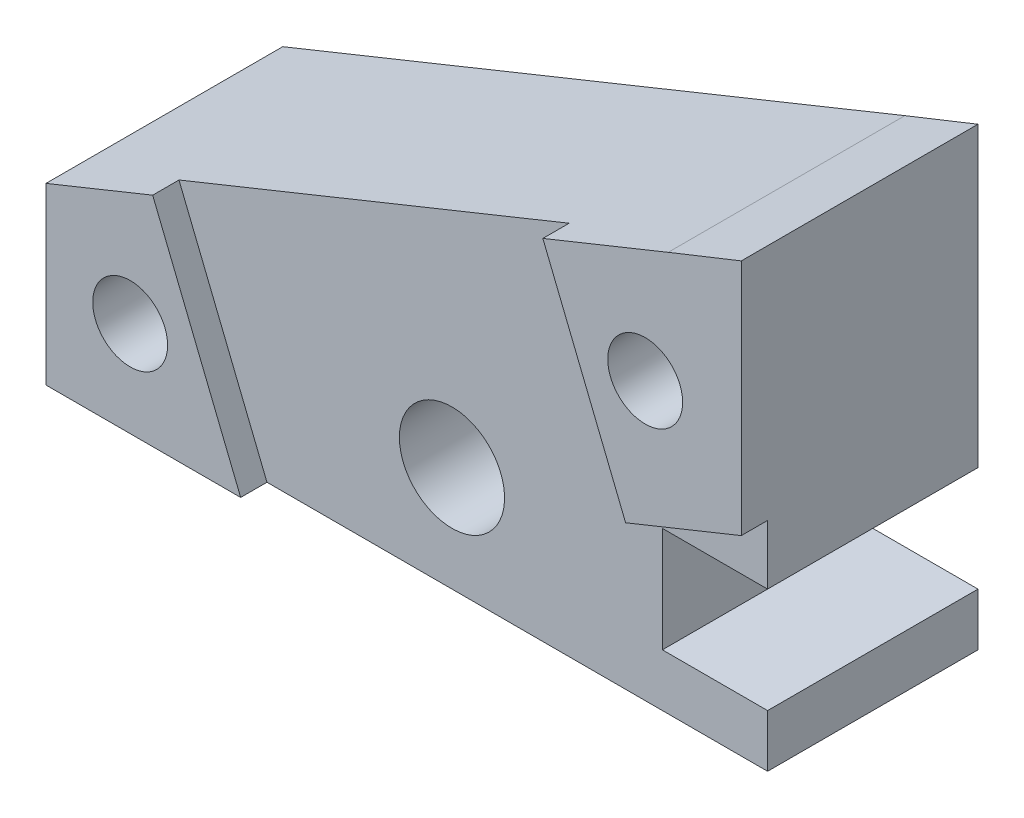
ISO-10303-21;
HEADER;
FILE_DESCRIPTION(('STEP AP214'),'2;1');
FILE_NAME('part.step','',(''),(''),'','','');
FILE_SCHEMA(('AUTOMOTIVE_DESIGN { 1 0 10303 214 1 1 1 1 }'));
ENDSEC;
DATA;
#1=APPLICATION_CONTEXT('core data for automotive mechanical design processes');
#2=APPLICATION_PROTOCOL_DEFINITION('international standard','automotive_design',2000,#1);
#3=PRODUCT_CONTEXT('',#1,'mechanical');
#4=PRODUCT('Part','Part','',(#3));
#5=PRODUCT_RELATED_PRODUCT_CATEGORY('part','',(#4));
#6=PRODUCT_DEFINITION_FORMATION('','',#4);
#7=PRODUCT_DEFINITION_CONTEXT('part definition',#1,'design');
#8=PRODUCT_DEFINITION('design','',#6,#7);
#9=PRODUCT_DEFINITION_SHAPE('','',#8);
#10=(LENGTH_UNIT() NAMED_UNIT(*) SI_UNIT(.MILLI.,.METRE.));
#11=(NAMED_UNIT(*) PLANE_ANGLE_UNIT() SI_UNIT($,.RADIAN.));
#12=(NAMED_UNIT(*) SI_UNIT($,.STERADIAN.) SOLID_ANGLE_UNIT());
#13=UNCERTAINTY_MEASURE_WITH_UNIT(LENGTH_MEASURE(1.E-05),#10,'distance_accuracy_value','');
#14=(GEOMETRIC_REPRESENTATION_CONTEXT(3) GLOBAL_UNCERTAINTY_ASSIGNED_CONTEXT((#13)) GLOBAL_UNIT_ASSIGNED_CONTEXT((#10,
#11,#12)) REPRESENTATION_CONTEXT('',''));
#15=CARTESIAN_POINT('',(0.,0.,0.));
#16=DIRECTION('',(0.,0.,1.));
#17=DIRECTION('',(1.,0.,0.));
#18=AXIS2_PLACEMENT_3D('',#15,#16,#17);
#19=CARTESIAN_POINT('',(-11.4586639342253,-3.17499999999992,7.14375));
#20=DIRECTION('',(0.,0.,-1.));
#21=DIRECTION('',(-1.,0.,0.));
#22=AXIS2_PLACEMENT_3D('',#19,#20,#21);
#23=PLANE('',#22);
#24=CARTESIAN_POINT('',(6.62464620373243,5.97889902913555,7.14375));
#25=DIRECTION('',(0.,0.,1.));
#26=DIRECTION('',(1.,0.,0.));
#27=AXIS2_PLACEMENT_3D('',#24,#25,#26);
#28=CIRCLE('',#27,1.1303);
#29=CARTESIAN_POINT('',(7.75494620373243,5.97889902913555,7.14375));
#30=VERTEX_POINT('',#29);
#31=EDGE_CURVE('E205',#30,#30,#28,.T.);
#32=ORIENTED_EDGE('',*,*,#31,.F.);
#33=EDGE_LOOP('',(#32));
#34=FACE_BOUND('',#33,.T.);
#35=DIRECTION('',(-0.927183854566792,-0.3746065934159,0.));
#36=VECTOR('',#35,1.);
#37=CARTESIAN_POINT('',(-11.4586639342253,2.09711529149145,7.14375));
#38=LINE('',#37,#36);
#39=CARTESIAN_POINT('',(7.31930786211666,9.68390836520623,7.14375));
#40=VERTEX_POINT('',#39);
#41=CARTESIAN_POINT('',(3.53588534169418,8.15530644354025,7.14375));
#42=VERTEX_POINT('',#41);
#43=EDGE_CURVE('E234',#40,#42,#38,.T.);
#44=ORIENTED_EDGE('',*,*,#43,.T.);
#45=DIRECTION('',(-0.374606593415902,0.927183854566792,0.));
#46=VECTOR('',#45,1.);
#47=CARTESIAN_POINT('',(3.43008651527397,8.41716772791981,7.14375));
#48=LINE('',#47,#46);
#49=CARTESIAN_POINT('',(6.03412093775411,1.97195636299551,7.14375));
#50=VERTEX_POINT('',#49);
#51=EDGE_CURVE('E319',#50,#42,#48,.T.);
#52=ORIENTED_EDGE('',*,*,#51,.F.);
#53=DIRECTION('',(-0.927183854566792,-0.374606593415902,0.));
#54=VECTOR('',#53,1.);
#55=CARTESIAN_POINT('',(6.03412093775411,1.97195636299551,7.14375));
#56=LINE('',#55,#54);
#57=CARTESIAN_POINT('',(9.52499999999998,3.38236305536164,7.14375));
#58=VERTEX_POINT('',#57);
#59=EDGE_CURVE('E316',#58,#50,#56,.T.);
#60=ORIENTED_EDGE('',*,*,#59,.F.);
#61=DIRECTION('',(0.,1.,0.));
#62=VECTOR('',#61,1.);
#63=CARTESIAN_POINT('',(9.52500000000001,1.58749999999994,7.14375));
#64=LINE('',#63,#62);
#65=CARTESIAN_POINT('',(9.52500000000003,10.562648806439,7.14375));
#66=VERTEX_POINT('',#65);
#67=EDGE_CURVE('E109',#58,#66,#64,.T.);
#68=ORIENTED_EDGE('',*,*,#67,.T.);
#69=DIRECTION('',(-0.928989410064675,-0.370106303631387,0.));
#70=VECTOR('',#69,1.);
#71=CARTESIAN_POINT('',(9.52500000000003,10.562648806439,7.14375));
#72=LINE('',#71,#70);
#73=EDGE_CURVE('E230',#66,#40,#72,.T.);
#74=ORIENTED_EDGE('',*,*,#73,.T.);
#75=EDGE_LOOP('',(#44,#52,#60,#68,#74));
#76=FACE_BOUND('',#75,.T.);
#77=ADVANCED_FACE('F40',(#34,#76),#23,.F.);
#78=CARTESIAN_POINT('',(-8.91866393422528,-0.301005902888601,7.14375));
#79=DIRECTION('',(0.,0.,1.));
#80=DIRECTION('',(1.,0.,0.));
#81=AXIS2_PLACEMENT_3D('',#78,#79,#80);
#82=CIRCLE('',#81,1.1303);
#83=CARTESIAN_POINT('',(-7.78836393422528,-0.301005902888601,7.14375));
#84=VERTEX_POINT('',#83);
#85=EDGE_CURVE('E213',#84,#84,#82,.T.);
#86=ORIENTED_EDGE('',*,*,#85,.F.);
#87=EDGE_LOOP('',(#86));
#88=FACE_BOUND('',#87,.T.);
#89=DIRECTION('',(1.,0.,0.));
#90=VECTOR('',#89,1.);
#91=CARTESIAN_POINT('',(9.52499999999998,-3.17500000000007,7.14375));
#92=LINE('',#91,#90);
#93=CARTESIAN_POINT('',(-11.4586639342253,-3.17499999999992,7.14375));
#94=VERTEX_POINT('',#93);
#95=CARTESIAN_POINT('',(-5.58376494037182,-3.17499999999996,7.14375));
#96=VERTEX_POINT('',#95);
#97=EDGE_CURVE('E225',#94,#96,#92,.T.);
#98=ORIENTED_EDGE('',*,*,#97,.T.);
#99=DIRECTION('',(0.374606593415901,-0.927183854566792,0.));
#100=VECTOR('',#99,1.);
#101=CARTESIAN_POINT('',(-8.34514843772422,3.6596639915379,7.14375));
#102=LINE('',#101,#100);
#103=CARTESIAN_POINT('',(-8.23934961130401,3.39780270715835,7.14375));
#104=VERTEX_POINT('',#103);
#105=EDGE_CURVE('E311',#104,#96,#102,.T.);
#106=ORIENTED_EDGE('',*,*,#105,.F.);
#107=CARTESIAN_POINT('',(-11.4586639342253,2.09711529149145,7.14375));
#108=VERTEX_POINT('',#107);
#109=EDGE_CURVE('E233',#104,#108,#38,.T.);
#110=ORIENTED_EDGE('',*,*,#109,.T.);
#111=DIRECTION('',(0.,-1.,0.));
#112=VECTOR('',#111,1.);
#113=CARTESIAN_POINT('',(-11.4586639342253,-3.17499999999992,7.14375));
#114=LINE('',#113,#112);
#115=EDGE_CURVE('E65',#108,#94,#114,.T.);
#116=ORIENTED_EDGE('',*,*,#115,.T.);
#117=EDGE_LOOP('',(#98,#106,#110,#116));
#118=FACE_BOUND('',#117,.T.);
#119=ADVANCED_FACE('F313',(#88,#118),#23,.F.);
#120=CARTESIAN_POINT('',(-11.4586639342253,-3.17499999999992,0.));
#121=DIRECTION('',(0.,0.,-1.));
#122=DIRECTION('',(-1.,0.,0.));
#123=AXIS2_PLACEMENT_3D('',#120,#121,#122);
#124=PLANE('',#123);
#125=CARTESIAN_POINT('',(-8.91866393422528,-0.301005902888601,0.));
#126=DIRECTION('',(0.,0.,1.));
#127=DIRECTION('',(1.,0.,0.));
#128=AXIS2_PLACEMENT_3D('',#125,#126,#127);
#129=CIRCLE('',#128,1.1303);
#130=CARTESIAN_POINT('',(-7.78836393422528,-0.301005902888601,0.));
#131=VERTEX_POINT('',#130);
#132=EDGE_CURVE('E209',#131,#131,#129,.T.);
#133=ORIENTED_EDGE('',*,*,#132,.T.);
#134=EDGE_LOOP('',(#133));
#135=FACE_BOUND('',#134,.T.);
#136=DIRECTION('',(1.,0.,0.));
#137=VECTOR('',#136,1.);
#138=CARTESIAN_POINT('',(9.52499999999998,-3.17500000000007,0.));
#139=LINE('',#138,#137);
#140=CARTESIAN_POINT('',(-11.4586639342253,-3.17499999999992,0.));
#141=VERTEX_POINT('',#140);
#142=CARTESIAN_POINT('',(9.52499999999998,-3.17500000000007,0.));
#143=VERTEX_POINT('',#142);
#144=EDGE_CURVE('E224',#141,#143,#139,.T.);
#145=ORIENTED_EDGE('',*,*,#144,.F.);
#146=DIRECTION('',(0.,-1.,0.));
#147=VECTOR('',#146,1.);
#148=CARTESIAN_POINT('',(-11.4586639342253,-3.17499999999992,0.));
#149=LINE('',#148,#147);
#150=CARTESIAN_POINT('',(-11.4586639342253,2.09711529149145,0.));
#151=VERTEX_POINT('',#150);
#152=EDGE_CURVE('E101',#151,#141,#149,.T.);
#153=ORIENTED_EDGE('',*,*,#152,.F.);
#154=DIRECTION('',(-0.927183854566792,-0.3746065934159,0.));
#155=VECTOR('',#154,1.);
#156=CARTESIAN_POINT('',(-11.4586639342253,2.09711529149145,0.));
#157=LINE('',#156,#155);
#158=CARTESIAN_POINT('',(7.31930786211666,9.68390836520623,0.));
#159=VERTEX_POINT('',#158);
#160=EDGE_CURVE('E266',#159,#151,#157,.T.);
#161=ORIENTED_EDGE('',*,*,#160,.F.);
#162=DIRECTION('',(-0.928989410064675,-0.370106303631387,0.));
#163=VECTOR('',#162,1.);
#164=CARTESIAN_POINT('',(9.52500000000003,10.562648806439,0.));
#165=LINE('',#164,#163);
#166=CARTESIAN_POINT('',(9.52500000000003,10.562648806439,0.));
#167=VERTEX_POINT('',#166);
#168=EDGE_CURVE('E263',#167,#159,#165,.T.);
#169=ORIENTED_EDGE('',*,*,#168,.F.);
#170=DIRECTION('',(0.,1.,0.));
#171=VECTOR('',#170,1.);
#172=CARTESIAN_POINT('',(9.52500000000003,4.22462875204722,0.));
#173=LINE('',#172,#171);
#174=CARTESIAN_POINT('',(9.52500000000001,1.58749999999994,0.));
#175=VERTEX_POINT('',#174);
#176=EDGE_CURVE('E260',#175,#167,#173,.T.);
#177=ORIENTED_EDGE('',*,*,#176,.F.);
#178=DIRECTION('',(1.,0.,0.));
#179=VECTOR('',#178,1.);
#180=CARTESIAN_POINT('',(6.35000000000001,1.58749999999996,0.));
#181=LINE('',#180,#179);
#182=CARTESIAN_POINT('',(6.35000000000001,1.58749999999996,0.));
#183=VERTEX_POINT('',#182);
#184=EDGE_CURVE('E256',#183,#175,#181,.T.);
#185=ORIENTED_EDGE('',*,*,#184,.F.);
#186=DIRECTION('',(0.,1.,0.));
#187=VECTOR('',#186,1.);
#188=CARTESIAN_POINT('',(6.34999999999999,-1.58750000000004,0.));
#189=LINE('',#188,#187);
#190=CARTESIAN_POINT('',(6.34999999999999,-1.58750000000004,0.));
#191=VERTEX_POINT('',#190);
#192=EDGE_CURVE('E252',#191,#183,#189,.T.);
#193=ORIENTED_EDGE('',*,*,#192,.F.);
#194=DIRECTION('',(-1.,0.,0.));
#195=VECTOR('',#194,1.);
#196=CARTESIAN_POINT('',(6.34999999999999,-1.58750000000004,0.));
#197=LINE('',#196,#195);
#198=CARTESIAN_POINT('',(9.52499999999999,-1.58750000000007,0.));
#199=VERTEX_POINT('',#198);
#200=EDGE_CURVE('E248',#199,#191,#197,.T.);
#201=ORIENTED_EDGE('',*,*,#200,.F.);
#202=DIRECTION('',(0.,1.,0.));
#203=VECTOR('',#202,1.);
#204=CARTESIAN_POINT('',(9.52499999999999,-1.58750000000007,0.));
#205=LINE('',#204,#203);
#206=EDGE_CURVE('E244',#143,#199,#205,.T.);
#207=ORIENTED_EDGE('',*,*,#206,.F.);
#208=EDGE_LOOP('',(#145,#153,#161,#169,#177,#185,#193,#201,#207));
#209=FACE_BOUND('',#208,.T.);
#210=CARTESIAN_POINT('',(0.,0.,0.));
#211=DIRECTION('',(0.,0.,1.));
#212=DIRECTION('',(1.,0.,0.));
#213=AXIS2_PLACEMENT_3D('',#210,#211,#212);
#214=CIRCLE('',#213,1.58749999999992);
#215=CARTESIAN_POINT('',(1.58749999999992,0.,0.));
#216=VERTEX_POINT('',#215);
#217=EDGE_CURVE('E217',#216,#216,#214,.T.);
#218=ORIENTED_EDGE('',*,*,#217,.T.);
#219=EDGE_LOOP('',(#218));
#220=FACE_BOUND('',#219,.T.);
#221=CARTESIAN_POINT('',(6.62464620373243,5.97889902913555,0.));
#222=DIRECTION('',(0.,0.,1.));
#223=DIRECTION('',(1.,0.,0.));
#224=AXIS2_PLACEMENT_3D('',#221,#222,#223);
#225=CIRCLE('',#224,1.1303);
#226=CARTESIAN_POINT('',(7.75494620373243,5.97889902913555,0.));
#227=VERTEX_POINT('',#226);
#228=EDGE_CURVE('E204',#227,#227,#225,.T.);
#229=ORIENTED_EDGE('',*,*,#228,.T.);
#230=EDGE_LOOP('',(#229));
#231=FACE_BOUND('',#230,.T.);
#232=ADVANCED_FACE('F336',(#135,#209,#220,#231),#124,.T.);
#233=CARTESIAN_POINT('',(9.52499999999998,-3.17500000000007,7.14375));
#234=DIRECTION('',(0.,1.,0.));
#235=DIRECTION('',(-1.,0.,0.));
#236=AXIS2_PLACEMENT_3D('',#233,#234,#235);
#237=PLANE('',#236);
#238=DIRECTION('',(-1.,0.,0.));
#239=VECTOR('',#238,1.);
#240=CARTESIAN_POINT('',(9.52499999999998,-3.17500000000007,6.35));
#241=LINE('',#240,#239);
#242=CARTESIAN_POINT('',(9.52499999999998,-3.17500000000007,6.35));
#243=VERTEX_POINT('',#242);
#244=CARTESIAN_POINT('',(-5.58376494037182,-3.17499999999996,6.35));
#245=VERTEX_POINT('',#244);
#246=EDGE_CURVE('E196',#243,#245,#241,.T.);
#247=ORIENTED_EDGE('',*,*,#246,.T.);
#248=DIRECTION('',(0.,0.,1.));
#249=VECTOR('',#248,1.);
#250=CARTESIAN_POINT('',(-5.58376494037182,-3.17499999999996,7.14375));
#251=LINE('',#250,#249);
#252=EDGE_CURVE('E200',#245,#96,#251,.T.);
#253=ORIENTED_EDGE('',*,*,#252,.T.);
#254=ORIENTED_EDGE('',*,*,#97,.F.);
#255=DIRECTION('',(0.,0.,-1.));
#256=VECTOR('',#255,1.);
#257=CARTESIAN_POINT('',(-11.4586639342253,-3.17499999999992,7.14375));
#258=LINE('',#257,#256);
#259=EDGE_CURVE('E240',#94,#141,#258,.T.);
#260=ORIENTED_EDGE('',*,*,#259,.T.);
#261=ORIENTED_EDGE('',*,*,#144,.T.);
#262=DIRECTION('',(0.,0.,-1.));
#263=VECTOR('',#262,1.);
#264=CARTESIAN_POINT('',(9.52499999999998,-3.17500000000007,7.14375));
#265=LINE('',#264,#263);
#266=EDGE_CURVE('E296',#243,#143,#265,.T.);
#267=ORIENTED_EDGE('',*,*,#266,.F.);
#268=EDGE_LOOP('',(#247,#253,#254,#260,#261,#267));
#269=FACE_BOUND('',#268,.T.);
#270=ADVANCED_FACE('F42',(#269),#237,.F.);
#271=CARTESIAN_POINT('',(9.52499999999999,-1.58750000000007,7.14375));
#272=DIRECTION('',(-1.,0.,0.));
#273=DIRECTION('',(0.,-1.,0.));
#274=AXIS2_PLACEMENT_3D('',#271,#272,#273);
#275=PLANE('',#274);
#276=DIRECTION('',(0.,0.,-1.));
#277=VECTOR('',#276,1.);
#278=CARTESIAN_POINT('',(9.52499999999999,-1.58750000000007,7.14375));
#279=LINE('',#278,#277);
#280=CARTESIAN_POINT('',(9.52499999999998,-1.58750000000005,6.35));
#281=VERTEX_POINT('',#280);
#282=EDGE_CURVE('E293',#281,#199,#279,.T.);
#283=ORIENTED_EDGE('',*,*,#282,.F.);
#284=DIRECTION('',(0.,1.,0.));
#285=VECTOR('',#284,1.);
#286=CARTESIAN_POINT('',(9.52499999999998,3.38236305536164,6.35));
#287=LINE('',#286,#285);
#288=EDGE_CURVE('E162',#243,#281,#287,.T.);
#289=ORIENTED_EDGE('',*,*,#288,.F.);
#290=ORIENTED_EDGE('',*,*,#266,.T.);
#291=ORIENTED_EDGE('',*,*,#206,.T.);
#292=EDGE_LOOP('',(#283,#289,#290,#291));
#293=FACE_BOUND('',#292,.T.);
#294=ADVANCED_FACE('F333',(#293),#275,.F.);
#295=CARTESIAN_POINT('',(6.34999999999999,-1.58750000000004,7.14375));
#296=DIRECTION('',(0.,-1.,0.));
#297=DIRECTION('',(1.,0.,0.));
#298=AXIS2_PLACEMENT_3D('',#295,#296,#297);
#299=PLANE('',#298);
#300=DIRECTION('',(0.,0.,-1.));
#301=VECTOR('',#300,1.);
#302=CARTESIAN_POINT('',(6.34999999999999,-1.58750000000004,7.14375));
#303=LINE('',#302,#301);
#304=CARTESIAN_POINT('',(6.34999999999999,-1.58750000000004,6.35));
#305=VERTEX_POINT('',#304);
#306=EDGE_CURVE('E290',#305,#191,#303,.T.);
#307=ORIENTED_EDGE('',*,*,#306,.F.);
#308=DIRECTION('',(1.,0.,0.));
#309=VECTOR('',#308,1.);
#310=CARTESIAN_POINT('',(6.34999999999999,-1.58750000000004,6.35));
#311=LINE('',#310,#309);
#312=EDGE_CURVE('E192',#305,#281,#311,.T.);
#313=ORIENTED_EDGE('',*,*,#312,.T.);
#314=ORIENTED_EDGE('',*,*,#282,.T.);
#315=ORIENTED_EDGE('',*,*,#200,.T.);
#316=EDGE_LOOP('',(#307,#313,#314,#315));
#317=FACE_BOUND('',#316,.T.);
#318=ADVANCED_FACE('F342',(#317),#299,.F.);
#319=CARTESIAN_POINT('',(6.34999999999999,-1.58750000000004,7.14375));
#320=DIRECTION('',(-1.,0.,0.));
#321=DIRECTION('',(0.,-1.,0.));
#322=AXIS2_PLACEMENT_3D('',#319,#320,#321);
#323=PLANE('',#322);
#324=DIRECTION('',(0.,0.,-1.));
#325=VECTOR('',#324,1.);
#326=CARTESIAN_POINT('',(6.35000000000001,1.58749999999996,7.14375));
#327=LINE('',#326,#325);
#328=CARTESIAN_POINT('',(6.35000000000001,1.58749999999996,6.35));
#329=VERTEX_POINT('',#328);
#330=EDGE_CURVE('E287',#329,#183,#327,.T.);
#331=ORIENTED_EDGE('',*,*,#330,.F.);
#332=DIRECTION('',(0.,-1.,0.));
#333=VECTOR('',#332,1.);
#334=CARTESIAN_POINT('',(6.34999999999999,-1.58750000000004,6.35));
#335=LINE('',#334,#333);
#336=EDGE_CURVE('E188',#329,#305,#335,.T.);
#337=ORIENTED_EDGE('',*,*,#336,.T.);
#338=ORIENTED_EDGE('',*,*,#306,.T.);
#339=ORIENTED_EDGE('',*,*,#192,.T.);
#340=EDGE_LOOP('',(#331,#337,#338,#339));
#341=FACE_BOUND('',#340,.T.);
#342=ADVANCED_FACE('F345',(#341),#323,.F.);
#343=CARTESIAN_POINT('',(6.35000000000001,1.58749999999996,7.14375));
#344=DIRECTION('',(0.,1.,0.));
#345=DIRECTION('',(-1.,0.,0.));
#346=AXIS2_PLACEMENT_3D('',#343,#344,#345);
#347=PLANE('',#346);
#348=DIRECTION('',(0.,0.,-1.));
#349=VECTOR('',#348,1.);
#350=CARTESIAN_POINT('',(9.52500000000001,1.58749999999994,7.14375));
#351=LINE('',#350,#349);
#352=CARTESIAN_POINT('',(9.52499999999998,1.58749999999994,6.35));
#353=VERTEX_POINT('',#352);
#354=EDGE_CURVE('E284',#353,#175,#351,.T.);
#355=ORIENTED_EDGE('',*,*,#354,.F.);
#356=DIRECTION('',(-1.,0.,0.));
#357=VECTOR('',#356,1.);
#358=CARTESIAN_POINT('',(6.35000000000001,1.58749999999996,6.35));
#359=LINE('',#358,#357);
#360=EDGE_CURVE('E157',#353,#329,#359,.T.);
#361=ORIENTED_EDGE('',*,*,#360,.T.);
#362=ORIENTED_EDGE('',*,*,#330,.T.);
#363=ORIENTED_EDGE('',*,*,#184,.T.);
#364=EDGE_LOOP('',(#355,#361,#362,#363));
#365=FACE_BOUND('',#364,.T.);
#366=ADVANCED_FACE('F347',(#365),#347,.F.);
#367=CARTESIAN_POINT('',(9.52500000000003,4.22462875204722,7.14375));
#368=DIRECTION('',(-1.,0.,0.));
#369=DIRECTION('',(0.,-1.,0.));
#370=AXIS2_PLACEMENT_3D('',#367,#368,#369);
#371=PLANE('',#370);
#372=ORIENTED_EDGE('',*,*,#67,.F.);
#373=DIRECTION('',(0.,0.,1.));
#374=VECTOR('',#373,1.);
#375=CARTESIAN_POINT('',(9.52499999999998,3.38236305536164,6.35));
#376=LINE('',#375,#374);
#377=CARTESIAN_POINT('',(9.52499999999998,3.38236305536164,6.35));
#378=VERTEX_POINT('',#377);
#379=EDGE_CURVE('E168',#378,#58,#376,.T.);
#380=ORIENTED_EDGE('',*,*,#379,.F.);
#381=EDGE_CURVE('E152',#353,#378,#287,.T.);
#382=ORIENTED_EDGE('',*,*,#381,.F.);
#383=ORIENTED_EDGE('',*,*,#354,.T.);
#384=ORIENTED_EDGE('',*,*,#176,.T.);
#385=DIRECTION('',(0.,0.,-1.));
#386=VECTOR('',#385,1.);
#387=CARTESIAN_POINT('',(9.52500000000003,10.562648806439,7.14375));
#388=LINE('',#387,#386);
#389=EDGE_CURVE('E280',#66,#167,#388,.T.);
#390=ORIENTED_EDGE('',*,*,#389,.F.);
#391=EDGE_LOOP('',(#372,#380,#382,#383,#384,#390));
#392=FACE_BOUND('',#391,.T.);
#393=ADVANCED_FACE('F172',(#392),#371,.F.);
#394=CARTESIAN_POINT('',(9.52500000000003,10.562648806439,7.14375));
#395=DIRECTION('',(0.370106303631387,-0.928989410064674,0.));
#396=DIRECTION('',(0.928989410064675,0.370106303631387,0.));
#397=AXIS2_PLACEMENT_3D('',#394,#395,#396);
#398=PLANE('',#397);
#399=ORIENTED_EDGE('',*,*,#168,.T.);
#400=DIRECTION('',(0.,0.,-1.));
#401=VECTOR('',#400,1.);
#402=CARTESIAN_POINT('',(7.31930786211666,9.68390836520623,7.14375));
#403=LINE('',#402,#401);
#404=EDGE_CURVE('E276',#40,#159,#403,.T.);
#405=ORIENTED_EDGE('',*,*,#404,.F.);
#406=ORIENTED_EDGE('',*,*,#73,.F.);
#407=ORIENTED_EDGE('',*,*,#389,.T.);
#408=EDGE_LOOP('',(#399,#405,#406,#407));
#409=FACE_BOUND('',#408,.T.);
#410=ADVANCED_FACE('F353',(#409),#398,.F.);
#411=CARTESIAN_POINT('',(-11.4586639342253,2.09711529149145,7.14375));
#412=DIRECTION('',(0.3746065934159,-0.927183854566792,0.));
#413=DIRECTION('',(0.927183854566792,0.3746065934159,0.));
#414=AXIS2_PLACEMENT_3D('',#411,#412,#413);
#415=PLANE('',#414);
#416=DIRECTION('',(0.927183854566792,0.3746065934159,0.));
#417=VECTOR('',#416,1.);
#418=CARTESIAN_POINT('',(-11.4586639342253,2.09711529149145,6.35));
#419=LINE('',#418,#417);
#420=CARTESIAN_POINT('',(-8.23934961130401,3.39780270715835,6.35));
#421=VERTEX_POINT('',#420);
#422=CARTESIAN_POINT('',(3.53588534169418,8.15530644354025,6.35));
#423=VERTEX_POINT('',#422);
#424=EDGE_CURVE('E182',#421,#423,#419,.T.);
#425=ORIENTED_EDGE('',*,*,#424,.T.);
#426=DIRECTION('',(0.,0.,1.));
#427=VECTOR('',#426,1.);
#428=CARTESIAN_POINT('',(3.53588534169418,8.15530644354025,7.14375));
#429=LINE('',#428,#427);
#430=EDGE_CURVE('E11',#423,#42,#429,.T.);
#431=ORIENTED_EDGE('',*,*,#430,.T.);
#432=ORIENTED_EDGE('',*,*,#43,.F.);
#433=ORIENTED_EDGE('',*,*,#404,.T.);
#434=ORIENTED_EDGE('',*,*,#160,.T.);
#435=DIRECTION('',(0.,0.,-1.));
#436=VECTOR('',#435,1.);
#437=CARTESIAN_POINT('',(-11.4586639342253,2.09711529149145,7.14375));
#438=LINE('',#437,#436);
#439=EDGE_CURVE('E273',#108,#151,#438,.T.);
#440=ORIENTED_EDGE('',*,*,#439,.F.);
#441=ORIENTED_EDGE('',*,*,#109,.F.);
#442=DIRECTION('',(0.,0.,-1.));
#443=VECTOR('',#442,1.);
#444=CARTESIAN_POINT('',(-8.23934961130401,3.39780270715834,7.14375));
#445=LINE('',#444,#443);
#446=EDGE_CURVE('E49',#104,#421,#445,.T.);
#447=ORIENTED_EDGE('',*,*,#446,.T.);
#448=EDGE_LOOP('',(#425,#431,#432,#433,#434,#440,#441,#447));
#449=FACE_BOUND('',#448,.T.);
#450=ADVANCED_FACE('F305',(#449),#415,.F.);
#451=CARTESIAN_POINT('',(-11.4586639342253,-3.17499999999992,7.14375));
#452=DIRECTION('',(1.,0.,0.));
#453=DIRECTION('',(0.,0.,-1.));
#454=AXIS2_PLACEMENT_3D('',#451,#452,#453);
#455=PLANE('',#454);
#456=ORIENTED_EDGE('',*,*,#152,.T.);
#457=ORIENTED_EDGE('',*,*,#259,.F.);
#458=ORIENTED_EDGE('',*,*,#115,.F.);
#459=ORIENTED_EDGE('',*,*,#439,.T.);
#460=EDGE_LOOP('',(#456,#457,#458,#459));
#461=FACE_BOUND('',#460,.T.);
#462=ADVANCED_FACE('F371',(#461),#455,.F.);
#463=CARTESIAN_POINT('',(0.,0.,7.14375));
#464=DIRECTION('',(0.,0.,-1.));
#465=DIRECTION('',(-1.,0.,0.));
#466=AXIS2_PLACEMENT_3D('',#463,#464,#465);
#467=CYLINDRICAL_SURFACE('',#466,1.58749999999992);
#468=CARTESIAN_POINT('',(0.,0.,6.35));
#469=DIRECTION('',(0.,0.,-1.));
#470=DIRECTION('',(-1.,0.,0.));
#471=AXIS2_PLACEMENT_3D('',#468,#469,#470);
#472=CIRCLE('',#471,1.58749999999992);
#473=CARTESIAN_POINT('',(-1.58749999999992,0.,6.35));
#474=VERTEX_POINT('',#473);
#475=EDGE_CURVE('E177',#474,#474,#472,.T.);
#476=ORIENTED_EDGE('',*,*,#475,.F.);
#477=EDGE_LOOP('',(#476));
#478=FACE_BOUND('',#477,.T.);
#479=ORIENTED_EDGE('',*,*,#217,.F.);
#480=EDGE_LOOP('',(#479));
#481=FACE_BOUND('',#480,.T.);
#482=ADVANCED_FACE('F366',(#478,#481),#467,.F.);
#483=CARTESIAN_POINT('',(-8.91866393422528,-0.301005902888601,7.14375));
#484=DIRECTION('',(0.,0.,-1.));
#485=DIRECTION('',(-1.,0.,0.));
#486=AXIS2_PLACEMENT_3D('',#483,#484,#485);
#487=CYLINDRICAL_SURFACE('',#486,1.1303);
#488=ORIENTED_EDGE('',*,*,#85,.T.);
#489=EDGE_LOOP('',(#488));
#490=FACE_BOUND('',#489,.T.);
#491=ORIENTED_EDGE('',*,*,#132,.F.);
#492=EDGE_LOOP('',(#491));
#493=FACE_BOUND('',#492,.T.);
#494=ADVANCED_FACE('F495',(#490,#493),#487,.F.);
#495=CARTESIAN_POINT('',(6.62464620373243,5.97889902913555,7.14375));
#496=DIRECTION('',(0.,0.,-1.));
#497=DIRECTION('',(-1.,0.,0.));
#498=AXIS2_PLACEMENT_3D('',#495,#496,#497);
#499=CYLINDRICAL_SURFACE('',#498,1.1303);
#500=ORIENTED_EDGE('',*,*,#31,.T.);
#501=EDGE_LOOP('',(#500));
#502=FACE_BOUND('',#501,.T.);
#503=ORIENTED_EDGE('',*,*,#228,.F.);
#504=EDGE_LOOP('',(#503));
#505=FACE_BOUND('',#504,.T.);
#506=ADVANCED_FACE('F422',(#502,#505),#499,.F.);
#507=CARTESIAN_POINT('',(3.43008651527397,8.41716772791981,6.35));
#508=DIRECTION('',(0.927183854566792,0.374606593415902,0.));
#509=DIRECTION('',(-0.374606593415902,0.927183854566792,0.));
#510=AXIS2_PLACEMENT_3D('',#507,#508,#509);
#511=PLANE('',#510);
#512=DIRECTION('',(-0.374606593415902,0.927183854566792,0.));
#513=VECTOR('',#512,1.);
#514=CARTESIAN_POINT('',(3.43008651527397,8.41716772791981,6.35));
#515=LINE('',#514,#513);
#516=CARTESIAN_POINT('',(6.03412093775411,1.97195636299551,6.35));
#517=VERTEX_POINT('',#516);
#518=EDGE_CURVE('E56',#517,#423,#515,.T.);
#519=ORIENTED_EDGE('',*,*,#518,.F.);
#520=DIRECTION('',(0.,0.,1.));
#521=VECTOR('',#520,1.);
#522=CARTESIAN_POINT('',(6.03412093775411,1.97195636299551,6.35));
#523=LINE('',#522,#521);
#524=EDGE_CURVE('E169',#517,#50,#523,.T.);
#525=ORIENTED_EDGE('',*,*,#524,.T.);
#526=ORIENTED_EDGE('',*,*,#51,.T.);
#527=ORIENTED_EDGE('',*,*,#430,.F.);
#528=EDGE_LOOP('',(#519,#525,#526,#527));
#529=FACE_BOUND('',#528,.T.);
#530=ADVANCED_FACE('F503',(#529),#511,.F.);
#531=CARTESIAN_POINT('',(-8.34514843772422,3.6596639915379,6.35));
#532=DIRECTION('',(-0.927183854566792,-0.374606593415901,0.));
#533=DIRECTION('',(0.374606593415901,-0.927183854566792,0.));
#534=AXIS2_PLACEMENT_3D('',#531,#532,#533);
#535=PLANE('',#534);
#536=DIRECTION('',(0.374606593415901,-0.927183854566792,0.));
#537=VECTOR('',#536,1.);
#538=CARTESIAN_POINT('',(-8.34514843772422,3.6596639915379,6.35));
#539=LINE('',#538,#537);
#540=EDGE_CURVE('E163',#421,#245,#539,.T.);
#541=ORIENTED_EDGE('',*,*,#540,.F.);
#542=ORIENTED_EDGE('',*,*,#446,.F.);
#543=ORIENTED_EDGE('',*,*,#105,.T.);
#544=ORIENTED_EDGE('',*,*,#252,.F.);
#545=EDGE_LOOP('',(#541,#542,#543,#544));
#546=FACE_BOUND('',#545,.T.);
#547=ADVANCED_FACE('F310',(#546),#535,.F.);
#548=CARTESIAN_POINT('',(3.43008651527397,8.41716772791981,6.35));
#549=DIRECTION('',(0.,0.,-1.));
#550=DIRECTION('',(-1.,0.,0.));
#551=AXIS2_PLACEMENT_3D('',#548,#549,#550);
#552=PLANE('',#551);
#553=ORIENTED_EDGE('',*,*,#475,.T.);
#554=EDGE_LOOP('',(#553));
#555=FACE_BOUND('',#554,.T.);
#556=ORIENTED_EDGE('',*,*,#288,.T.);
#557=ORIENTED_EDGE('',*,*,#312,.F.);
#558=ORIENTED_EDGE('',*,*,#336,.F.);
#559=ORIENTED_EDGE('',*,*,#360,.F.);
#560=ORIENTED_EDGE('',*,*,#381,.T.);
#561=DIRECTION('',(-0.927183854566792,-0.374606593415902,0.));
#562=VECTOR('',#561,1.);
#563=CARTESIAN_POINT('',(6.03412093775411,1.97195636299551,6.35));
#564=LINE('',#563,#562);
#565=EDGE_CURVE('E155',#378,#517,#564,.T.);
#566=ORIENTED_EDGE('',*,*,#565,.T.);
#567=ORIENTED_EDGE('',*,*,#518,.T.);
#568=ORIENTED_EDGE('',*,*,#424,.F.);
#569=ORIENTED_EDGE('',*,*,#540,.T.);
#570=ORIENTED_EDGE('',*,*,#246,.F.);
#571=EDGE_LOOP('',(#556,#557,#558,#559,#560,#566,#567,#568,#569,#570));
#572=FACE_BOUND('',#571,.T.);
#573=ADVANCED_FACE('F154',(#555,#572),#552,.F.);
#574=CARTESIAN_POINT('',(6.03412093775411,1.97195636299551,6.35));
#575=DIRECTION('',(-0.374606593415902,0.927183854566792,0.));
#576=DIRECTION('',(-0.927183854566792,-0.374606593415902,0.));
#577=AXIS2_PLACEMENT_3D('',#574,#575,#576);
#578=PLANE('',#577);
#579=ORIENTED_EDGE('',*,*,#59,.T.);
#580=ORIENTED_EDGE('',*,*,#524,.F.);
#581=ORIENTED_EDGE('',*,*,#565,.F.);
#582=ORIENTED_EDGE('',*,*,#379,.T.);
#583=EDGE_LOOP('',(#579,#580,#581,#582));
#584=FACE_BOUND('',#583,.T.);
#585=ADVANCED_FACE('F167',(#584),#578,.F.);
#586=CLOSED_SHELL('',(#77,#119,#232,#270,#294,#318,#342,#366,#393,#410,#450,#462,#482,#494,#506,
#530,#547,#573,#585));
#587=MANIFOLD_SOLID_BREP('B2',#586);
#588=ADVANCED_BREP_SHAPE_REPRESENTATION('',(#18,#587),#14);
#589=SHAPE_DEFINITION_REPRESENTATION(#9,#588);
ENDSEC;
END-ISO-10303-21;
